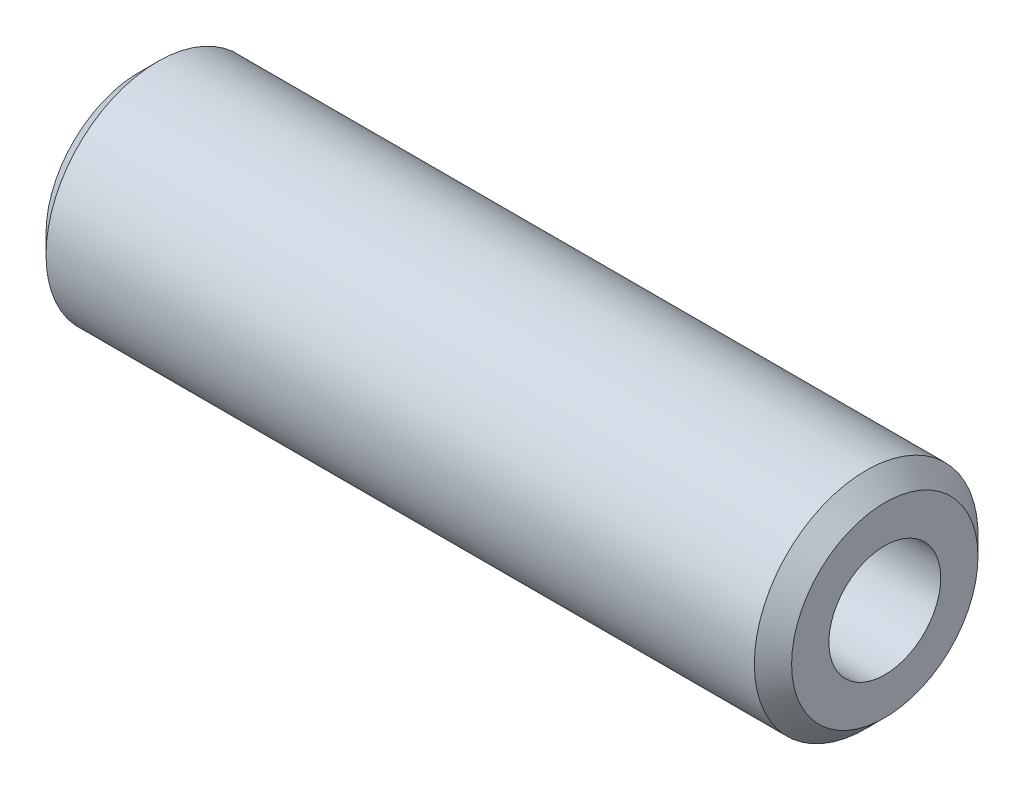
ISO-10303-21;
HEADER;
FILE_DESCRIPTION(('STEP AP214'),'2;1');
FILE_NAME('part.step','',(''),(''),'','','');
FILE_SCHEMA(('AUTOMOTIVE_DESIGN { 1 0 10303 214 1 1 1 1 }'));
ENDSEC;
DATA;
#1=APPLICATION_CONTEXT('core data for automotive mechanical design processes');
#2=APPLICATION_PROTOCOL_DEFINITION('international standard','automotive_design',2000,#1);
#3=PRODUCT_CONTEXT('',#1,'mechanical');
#4=PRODUCT('Part','Part','',(#3));
#5=PRODUCT_RELATED_PRODUCT_CATEGORY('part','',(#4));
#6=PRODUCT_DEFINITION_FORMATION('','',#4);
#7=PRODUCT_DEFINITION_CONTEXT('part definition',#1,'design');
#8=PRODUCT_DEFINITION('design','',#6,#7);
#9=PRODUCT_DEFINITION_SHAPE('','',#8);
#10=(LENGTH_UNIT() NAMED_UNIT(*) SI_UNIT(.MILLI.,.METRE.));
#11=(NAMED_UNIT(*) PLANE_ANGLE_UNIT() SI_UNIT($,.RADIAN.));
#12=(NAMED_UNIT(*) SI_UNIT($,.STERADIAN.) SOLID_ANGLE_UNIT());
#13=UNCERTAINTY_MEASURE_WITH_UNIT(LENGTH_MEASURE(1.E-05),#10,'distance_accuracy_value','');
#14=(GEOMETRIC_REPRESENTATION_CONTEXT(3) GLOBAL_UNCERTAINTY_ASSIGNED_CONTEXT((#13)) GLOBAL_UNIT_ASSIGNED_CONTEXT((#10,
#11,#12)) REPRESENTATION_CONTEXT('',''));
#15=CARTESIAN_POINT('',(0.,0.,0.));
#16=DIRECTION('',(0.,0.,1.));
#17=DIRECTION('',(1.,0.,0.));
#18=AXIS2_PLACEMENT_3D('',#15,#16,#17);
#19=CARTESIAN_POINT('',(10.,0.,0.));
#20=DIRECTION('',(-1.,0.,0.));
#21=DIRECTION('',(0.,0.,1.));
#22=AXIS2_PLACEMENT_3D('',#19,#20,#21);
#23=PLANE('',#22);
#24=CARTESIAN_POINT('',(10.,0.,0.));
#25=DIRECTION('',(-1.,0.,0.));
#26=DIRECTION('',(0.,0.,1.));
#27=AXIS2_PLACEMENT_3D('',#24,#25,#26);
#28=CIRCLE('',#27,2.5);
#29=CARTESIAN_POINT('',(10.,0.,2.5));
#30=VERTEX_POINT('',#29);
#31=EDGE_CURVE('E41',#30,#30,#28,.F.);
#32=ORIENTED_EDGE('',*,*,#31,.T.);
#33=EDGE_LOOP('',(#32));
#34=FACE_BOUND('',#33,.T.);
#35=CARTESIAN_POINT('',(10.,0.,0.));
#36=DIRECTION('',(1.,0.,0.));
#37=DIRECTION('',(0.,0.,-1.));
#38=AXIS2_PLACEMENT_3D('',#35,#36,#37);
#39=CIRCLE('',#38,1.49999999999999);
#40=CARTESIAN_POINT('',(10.,0.,-1.49999999999999));
#41=VERTEX_POINT('',#40);
#42=EDGE_CURVE('E57',#41,#41,#39,.T.);
#43=ORIENTED_EDGE('',*,*,#42,.F.);
#44=EDGE_LOOP('',(#43));
#45=FACE_BOUND('',#44,.T.);
#46=ADVANCED_FACE('F33',(#34,#45),#23,.F.);
#47=CARTESIAN_POINT('',(0.,0.,0.));
#48=DIRECTION('',(-1.,0.,0.));
#49=DIRECTION('',(0.,0.,1.));
#50=AXIS2_PLACEMENT_3D('',#47,#48,#49);
#51=CYLINDRICAL_SURFACE('',#50,3.);
#52=CARTESIAN_POINT('',(9.5,0.,0.));
#53=DIRECTION('',(-1.,0.,0.));
#54=DIRECTION('',(0.,0.,1.));
#55=AXIS2_PLACEMENT_3D('',#52,#53,#54);
#56=CIRCLE('',#55,3.);
#57=CARTESIAN_POINT('',(9.5,0.,3.));
#58=VERTEX_POINT('',#57);
#59=EDGE_CURVE('E79',#58,#58,#56,.T.);
#60=ORIENTED_EDGE('',*,*,#59,.T.);
#61=EDGE_LOOP('',(#60));
#62=FACE_BOUND('',#61,.T.);
#63=CARTESIAN_POINT('',(-9.5,0.,0.));
#64=DIRECTION('',(1.,0.,0.));
#65=DIRECTION('',(0.,0.,-1.));
#66=AXIS2_PLACEMENT_3D('',#63,#64,#65);
#67=CIRCLE('',#66,3.);
#68=CARTESIAN_POINT('',(-9.5,0.,-3.));
#69=VERTEX_POINT('',#68);
#70=EDGE_CURVE('E76',#69,#69,#67,.T.);
#71=ORIENTED_EDGE('',*,*,#70,.T.);
#72=EDGE_LOOP('',(#71));
#73=FACE_BOUND('',#72,.T.);
#74=ADVANCED_FACE('F92',(#62,#73),#51,.T.);
#75=CARTESIAN_POINT('',(-10.,0.,0.));
#76=DIRECTION('',(1.,0.,0.));
#77=DIRECTION('',(0.,0.,-1.));
#78=AXIS2_PLACEMENT_3D('',#75,#76,#77);
#79=PLANE('',#78);
#80=CARTESIAN_POINT('',(-10.,0.,0.));
#81=DIRECTION('',(1.,0.,0.));
#82=DIRECTION('',(0.,0.,-1.));
#83=AXIS2_PLACEMENT_3D('',#80,#81,#82);
#84=CIRCLE('',#83,2.5);
#85=CARTESIAN_POINT('',(-10.,0.,-2.5));
#86=VERTEX_POINT('',#85);
#87=EDGE_CURVE('E11',#86,#86,#84,.F.);
#88=ORIENTED_EDGE('',*,*,#87,.T.);
#89=EDGE_LOOP('',(#88));
#90=FACE_BOUND('',#89,.T.);
#91=CARTESIAN_POINT('',(-10.,0.,0.));
#92=DIRECTION('',(-1.,0.,0.));
#93=DIRECTION('',(0.,0.,1.));
#94=AXIS2_PLACEMENT_3D('',#91,#92,#93);
#95=CIRCLE('',#94,1.49999999999999);
#96=CARTESIAN_POINT('',(-10.,0.,1.49999999999999));
#97=VERTEX_POINT('',#96);
#98=EDGE_CURVE('E109',#97,#97,#95,.T.);
#99=ORIENTED_EDGE('',*,*,#98,.F.);
#100=EDGE_LOOP('',(#99));
#101=FACE_BOUND('',#100,.T.);
#102=ADVANCED_FACE('F95',(#90,#101),#79,.F.);
#103=CARTESIAN_POINT('',(1.5,0.,0.));
#104=DIRECTION('',(1.,0.,0.));
#105=DIRECTION('',(0.,0.,-1.));
#106=AXIS2_PLACEMENT_3D('',#103,#104,#105);
#107=CONICAL_SURFACE('',#106,1.25,1.02974425867665);
#108=CARTESIAN_POINT('',(0.748924226215548,0.,0.));
#109=VERTEX_POINT('',#108);
#110=VERTEX_LOOP('',#109);
#111=FACE_BOUND('',#110,.T.);
#112=CARTESIAN_POINT('',(1.5,0.,0.));
#113=DIRECTION('',(1.,0.,0.));
#114=DIRECTION('',(0.,0.,-1.));
#115=AXIS2_PLACEMENT_3D('',#112,#113,#114);
#116=CIRCLE('',#115,1.25);
#117=CARTESIAN_POINT('',(1.5,0.,-1.25));
#118=VERTEX_POINT('',#117);
#119=EDGE_CURVE('E73',#118,#118,#116,.T.);
#120=ORIENTED_EDGE('',*,*,#119,.T.);
#121=EDGE_LOOP('',(#120));
#122=FACE_BOUND('',#121,.T.);
#123=ADVANCED_FACE('F105',(#111,#122),#107,.F.);
#124=CARTESIAN_POINT('',(10.,0.,0.));
#125=DIRECTION('',(1.,0.,0.));
#126=DIRECTION('',(0.,0.,-1.));
#127=AXIS2_PLACEMENT_3D('',#124,#125,#126);
#128=CYLINDRICAL_SURFACE('',#127,1.25);
#129=ORIENTED_EDGE('',*,*,#119,.F.);
#130=EDGE_LOOP('',(#129));
#131=FACE_BOUND('',#130,.T.);
#132=CARTESIAN_POINT('',(4.,0.,0.));
#133=DIRECTION('',(1.,0.,0.));
#134=DIRECTION('',(0.,0.,-1.));
#135=AXIS2_PLACEMENT_3D('',#132,#133,#134);
#136=CIRCLE('',#135,1.25);
#137=CARTESIAN_POINT('',(4.,0.,-1.25));
#138=VERTEX_POINT('',#137);
#139=EDGE_CURVE('E70',#138,#138,#136,.T.);
#140=ORIENTED_EDGE('',*,*,#139,.T.);
#141=EDGE_LOOP('',(#140));
#142=FACE_BOUND('',#141,.T.);
#143=ADVANCED_FACE('F131',(#131,#142),#128,.F.);
#144=CARTESIAN_POINT('',(4.,1.25,0.));
#145=DIRECTION('',(-1.,0.,0.));
#146=DIRECTION('',(0.,0.,1.));
#147=AXIS2_PLACEMENT_3D('',#144,#145,#146);
#148=PLANE('',#147);
#149=ORIENTED_EDGE('',*,*,#139,.F.);
#150=EDGE_LOOP('',(#149));
#151=FACE_BOUND('',#150,.T.);
#152=CARTESIAN_POINT('',(4.,0.,0.));
#153=DIRECTION('',(1.,0.,0.));
#154=DIRECTION('',(0.,0.,-1.));
#155=AXIS2_PLACEMENT_3D('',#152,#153,#154);
#156=CIRCLE('',#155,1.49999999999999);
#157=CARTESIAN_POINT('',(4.,0.,-1.49999999999999));
#158=VERTEX_POINT('',#157);
#159=EDGE_CURVE('E61',#158,#158,#156,.T.);
#160=ORIENTED_EDGE('',*,*,#159,.T.);
#161=EDGE_LOOP('',(#160));
#162=FACE_BOUND('',#161,.T.);
#163=ADVANCED_FACE('F134',(#151,#162),#148,.F.);
#164=CARTESIAN_POINT('',(10.,0.,0.));
#165=DIRECTION('',(1.,0.,0.));
#166=DIRECTION('',(0.,0.,-1.));
#167=AXIS2_PLACEMENT_3D('',#164,#165,#166);
#168=CYLINDRICAL_SURFACE('',#167,1.49999999999999);
#169=ORIENTED_EDGE('',*,*,#159,.F.);
#170=EDGE_LOOP('',(#169));
#171=FACE_BOUND('',#170,.T.);
#172=ORIENTED_EDGE('',*,*,#42,.T.);
#173=EDGE_LOOP('',(#172));
#174=FACE_BOUND('',#173,.T.);
#175=ADVANCED_FACE('F51',(#171,#174),#168,.F.);
#176=CARTESIAN_POINT('',(-1.50000000000001,0.,0.));
#177=DIRECTION('',(-1.,0.,0.));
#178=DIRECTION('',(0.,0.,1.));
#179=AXIS2_PLACEMENT_3D('',#176,#177,#178);
#180=CONICAL_SURFACE('',#179,1.25,1.02974425867665);
#181=CARTESIAN_POINT('',(-0.74892422621555,0.,0.));
#182=VERTEX_POINT('',#181);
#183=VERTEX_LOOP('',#182);
#184=FACE_BOUND('',#183,.T.);
#185=CARTESIAN_POINT('',(-1.50000000000001,0.,0.));
#186=DIRECTION('',(-1.,0.,0.));
#187=DIRECTION('',(0.,0.,1.));
#188=AXIS2_PLACEMENT_3D('',#185,#186,#187);
#189=CIRCLE('',#188,1.25);
#190=CARTESIAN_POINT('',(-1.50000000000001,0.,1.25));
#191=VERTEX_POINT('',#190);
#192=EDGE_CURVE('E55',#191,#191,#189,.T.);
#193=ORIENTED_EDGE('',*,*,#192,.T.);
#194=EDGE_LOOP('',(#193));
#195=FACE_BOUND('',#194,.T.);
#196=ADVANCED_FACE('F47',(#184,#195),#180,.F.);
#197=CARTESIAN_POINT('',(-10.,0.,0.));
#198=DIRECTION('',(-1.,0.,0.));
#199=DIRECTION('',(0.,0.,1.));
#200=AXIS2_PLACEMENT_3D('',#197,#198,#199);
#201=CYLINDRICAL_SURFACE('',#200,1.25);
#202=ORIENTED_EDGE('',*,*,#192,.F.);
#203=EDGE_LOOP('',(#202));
#204=FACE_BOUND('',#203,.T.);
#205=CARTESIAN_POINT('',(-4.,0.,0.));
#206=DIRECTION('',(-1.,0.,0.));
#207=DIRECTION('',(0.,0.,1.));
#208=AXIS2_PLACEMENT_3D('',#205,#206,#207);
#209=CIRCLE('',#208,1.25);
#210=CARTESIAN_POINT('',(-4.,0.,1.25));
#211=VERTEX_POINT('',#210);
#212=EDGE_CURVE('E58',#211,#211,#209,.T.);
#213=ORIENTED_EDGE('',*,*,#212,.T.);
#214=EDGE_LOOP('',(#213));
#215=FACE_BOUND('',#214,.T.);
#216=ADVANCED_FACE('F50',(#204,#215),#201,.F.);
#217=CARTESIAN_POINT('',(-4.,1.25,0.));
#218=DIRECTION('',(1.,0.,0.));
#219=DIRECTION('',(0.,0.,-1.));
#220=AXIS2_PLACEMENT_3D('',#217,#218,#219);
#221=PLANE('',#220);
#222=ORIENTED_EDGE('',*,*,#212,.F.);
#223=EDGE_LOOP('',(#222));
#224=FACE_BOUND('',#223,.T.);
#225=CARTESIAN_POINT('',(-4.,0.,0.));
#226=DIRECTION('',(-1.,0.,0.));
#227=DIRECTION('',(0.,0.,1.));
#228=AXIS2_PLACEMENT_3D('',#225,#226,#227);
#229=CIRCLE('',#228,1.49999999999999);
#230=CARTESIAN_POINT('',(-4.,0.,1.49999999999999));
#231=VERTEX_POINT('',#230);
#232=EDGE_CURVE('E64',#231,#231,#229,.T.);
#233=ORIENTED_EDGE('',*,*,#232,.T.);
#234=EDGE_LOOP('',(#233));
#235=FACE_BOUND('',#234,.T.);
#236=ADVANCED_FACE('F115',(#224,#235),#221,.F.);
#237=CARTESIAN_POINT('',(-10.,0.,0.));
#238=DIRECTION('',(-1.,0.,0.));
#239=DIRECTION('',(0.,0.,1.));
#240=AXIS2_PLACEMENT_3D('',#237,#238,#239);
#241=CYLINDRICAL_SURFACE('',#240,1.49999999999999);
#242=ORIENTED_EDGE('',*,*,#232,.F.);
#243=EDGE_LOOP('',(#242));
#244=FACE_BOUND('',#243,.T.);
#245=ORIENTED_EDGE('',*,*,#98,.T.);
#246=EDGE_LOOP('',(#245));
#247=FACE_BOUND('',#246,.T.);
#248=ADVANCED_FACE('F89',(#244,#247),#241,.F.);
#249=CARTESIAN_POINT('',(9.5,0.,0.));
#250=DIRECTION('',(-1.,0.,0.));
#251=DIRECTION('',(0.,0.,1.));
#252=AXIS2_PLACEMENT_3D('',#249,#250,#251);
#253=CONICAL_SURFACE('',#252,3.,0.785398163397451);
#254=ORIENTED_EDGE('',*,*,#31,.F.);
#255=EDGE_LOOP('',(#254));
#256=FACE_BOUND('',#255,.T.);
#257=ORIENTED_EDGE('',*,*,#59,.F.);
#258=EDGE_LOOP('',(#257));
#259=FACE_BOUND('',#258,.T.);
#260=ADVANCED_FACE('F86',(#256,#259),#253,.T.);
#261=CARTESIAN_POINT('',(-10.,0.,0.));
#262=DIRECTION('',(1.,0.,0.));
#263=DIRECTION('',(0.,0.,-1.));
#264=AXIS2_PLACEMENT_3D('',#261,#262,#263);
#265=CONICAL_SURFACE('',#264,2.5,0.785398163397447);
#266=ORIENTED_EDGE('',*,*,#70,.F.);
#267=EDGE_LOOP('',(#266));
#268=FACE_BOUND('',#267,.T.);
#269=ORIENTED_EDGE('',*,*,#87,.F.);
#270=EDGE_LOOP('',(#269));
#271=FACE_BOUND('',#270,.T.);
#272=ADVANCED_FACE('F35',(#268,#271),#265,.T.);
#273=CLOSED_SHELL('',(#46,#74,#102,#123,#143,#163,#175,#196,#216,#236,#248,#260,#272));
#274=MANIFOLD_SOLID_BREP('B2',#273);
#275=ADVANCED_BREP_SHAPE_REPRESENTATION('',(#18,#274),#14);
#276=SHAPE_DEFINITION_REPRESENTATION(#9,#275);
ENDSEC;
END-ISO-10303-21;
